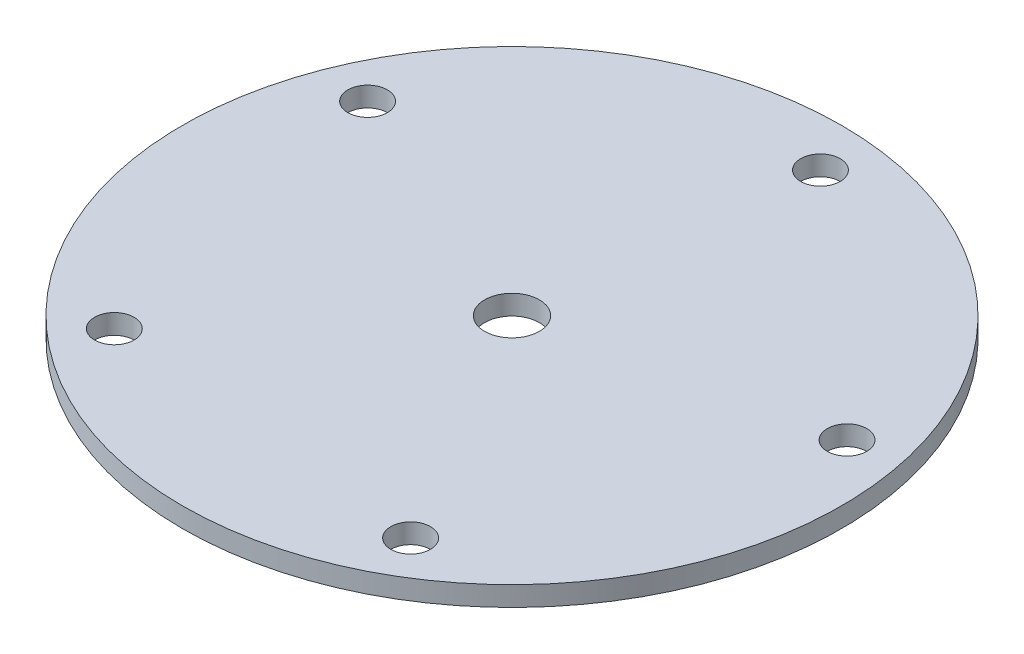
ISO-10303-21;
HEADER;
FILE_DESCRIPTION(('STEP AP214'),'2;1');
FILE_NAME('part.step','',(''),(''),'','','');
FILE_SCHEMA(('AUTOMOTIVE_DESIGN { 1 0 10303 214 1 1 1 1 }'));
ENDSEC;
DATA;
#1=APPLICATION_CONTEXT('core data for automotive mechanical design processes');
#2=APPLICATION_PROTOCOL_DEFINITION('international standard','automotive_design',2000,#1);
#3=PRODUCT_CONTEXT('',#1,'mechanical');
#4=PRODUCT('Part','Part','',(#3));
#5=PRODUCT_RELATED_PRODUCT_CATEGORY('part','',(#4));
#6=PRODUCT_DEFINITION_FORMATION('','',#4);
#7=PRODUCT_DEFINITION_CONTEXT('part definition',#1,'design');
#8=PRODUCT_DEFINITION('design','',#6,#7);
#9=PRODUCT_DEFINITION_SHAPE('','',#8);
#10=(LENGTH_UNIT() NAMED_UNIT(*) SI_UNIT(.MILLI.,.METRE.));
#11=(NAMED_UNIT(*) PLANE_ANGLE_UNIT() SI_UNIT($,.RADIAN.));
#12=(NAMED_UNIT(*) SI_UNIT($,.STERADIAN.) SOLID_ANGLE_UNIT());
#13=UNCERTAINTY_MEASURE_WITH_UNIT(LENGTH_MEASURE(1.E-05),#10,'distance_accuracy_value','');
#14=(GEOMETRIC_REPRESENTATION_CONTEXT(3) GLOBAL_UNCERTAINTY_ASSIGNED_CONTEXT((#13)) GLOBAL_UNIT_ASSIGNED_CONTEXT((#10,
#11,#12)) REPRESENTATION_CONTEXT('',''));
#15=CARTESIAN_POINT('',(0.,0.,0.));
#16=DIRECTION('',(0.,0.,1.));
#17=DIRECTION('',(1.,0.,0.));
#18=AXIS2_PLACEMENT_3D('',#15,#16,#17);
#19=CARTESIAN_POINT('',(0.,3.,0.));
#20=DIRECTION('',(0.,-1.,0.));
#21=DIRECTION('',(0.,0.,-1.));
#22=AXIS2_PLACEMENT_3D('',#19,#20,#21);
#23=CYLINDRICAL_SURFACE('',#22,50.);
#24=CARTESIAN_POINT('',(0.,3.,0.));
#25=DIRECTION('',(0.,1.,0.));
#26=DIRECTION('',(0.,0.,1.));
#27=AXIS2_PLACEMENT_3D('',#24,#25,#26);
#28=CIRCLE('',#27,50.);
#29=CARTESIAN_POINT('',(0.,3.,50.));
#30=VERTEX_POINT('',#29);
#31=EDGE_CURVE('E10',#30,#30,#28,.T.);
#32=ORIENTED_EDGE('',*,*,#31,.F.);
#33=EDGE_LOOP('',(#32));
#34=FACE_BOUND('',#33,.T.);
#35=CARTESIAN_POINT('',(0.,0.,0.));
#36=DIRECTION('',(0.,1.,0.));
#37=DIRECTION('',(0.,0.,1.));
#38=AXIS2_PLACEMENT_3D('',#35,#36,#37);
#39=CIRCLE('',#38,50.);
#40=CARTESIAN_POINT('',(0.,0.,50.));
#41=VERTEX_POINT('',#40);
#42=EDGE_CURVE('E45',#41,#41,#39,.T.);
#43=ORIENTED_EDGE('',*,*,#42,.T.);
#44=EDGE_LOOP('',(#43));
#45=FACE_BOUND('',#44,.T.);
#46=ADVANCED_FACE('F37',(#34,#45),#23,.T.);
#47=CARTESIAN_POINT('',(0.,3.,0.));
#48=DIRECTION('',(0.,1.,0.));
#49=DIRECTION('',(0.,0.,1.));
#50=AXIS2_PLACEMENT_3D('',#47,#48,#49);
#51=PLANE('',#50);
#52=CARTESIAN_POINT('',(21.5307676084281,3.,36.91156861408));
#53=DIRECTION('',(0.,1.,0.));
#54=DIRECTION('',(0.,0.,1.));
#55=AXIS2_PLACEMENT_3D('',#52,#53,#54);
#56=CIRCLE('',#55,3.);
#57=CARTESIAN_POINT('',(21.5307676084281,3.,39.91156861408));
#58=VERTEX_POINT('',#57);
#59=EDGE_CURVE('E152',#58,#58,#56,.T.);
#60=ORIENTED_EDGE('',*,*,#59,.F.);
#61=EDGE_LOOP('',(#60));
#62=FACE_BOUND('',#61,.T.);
#63=CARTESIAN_POINT('',(41.7583609500383,3.,-9.07067484404461));
#64=DIRECTION('',(0.,1.,0.));
#65=DIRECTION('',(0.,0.,1.));
#66=AXIS2_PLACEMENT_3D('',#63,#64,#65);
#67=CIRCLE('',#66,3.);
#68=CARTESIAN_POINT('',(41.7583609500383,3.,-6.07067484404461));
#69=VERTEX_POINT('',#68);
#70=EDGE_CURVE('E146',#69,#69,#67,.T.);
#71=ORIENTED_EDGE('',*,*,#70,.F.);
#72=EDGE_LOOP('',(#71));
#73=FACE_BOUND('',#72,.T.);
#74=CARTESIAN_POINT('',(4.27731877318173,3.,-42.5175539685982));
#75=DIRECTION('',(0.,1.,0.));
#76=DIRECTION('',(0.,0.,1.));
#77=AXIS2_PLACEMENT_3D('',#74,#75,#76);
#78=CIRCLE('',#77,3.);
#79=CARTESIAN_POINT('',(4.27731877318173,3.,-39.5175539685982));
#80=VERTEX_POINT('',#79);
#81=EDGE_CURVE('E140',#80,#80,#78,.T.);
#82=ORIENTED_EDGE('',*,*,#81,.F.);
#83=EDGE_LOOP('',(#82));
#84=FACE_BOUND('',#83,.T.);
#85=CARTESIAN_POINT('',(-39.1148325674941,3.,-17.2066186270568));
#86=DIRECTION('',(0.,1.,0.));
#87=DIRECTION('',(0.,0.,1.));
#88=AXIS2_PLACEMENT_3D('',#85,#86,#87);
#89=CIRCLE('',#88,3.);
#90=CARTESIAN_POINT('',(-39.1148325674941,3.,-14.2066186270568));
#91=VERTEX_POINT('',#90);
#92=EDGE_CURVE('E127',#91,#91,#89,.T.);
#93=ORIENTED_EDGE('',*,*,#92,.F.);
#94=EDGE_LOOP('',(#93));
#95=FACE_BOUND('',#94,.T.);
#96=CARTESIAN_POINT('',(-28.4516147641542,3.,31.8832788256201));
#97=DIRECTION('',(0.,1.,0.));
#98=DIRECTION('',(0.,0.,1.));
#99=AXIS2_PLACEMENT_3D('',#96,#97,#98);
#100=CIRCLE('',#99,3.);
#101=CARTESIAN_POINT('',(-28.4516147641542,3.,34.8832788256201));
#102=VERTEX_POINT('',#101);
#103=EDGE_CURVE('E65',#102,#102,#100,.T.);
#104=ORIENTED_EDGE('',*,*,#103,.F.);
#105=EDGE_LOOP('',(#104));
#106=FACE_BOUND('',#105,.T.);
#107=CARTESIAN_POINT('',(0.,3.,0.));
#108=DIRECTION('',(0.,1.,0.));
#109=DIRECTION('',(0.,0.,1.));
#110=AXIS2_PLACEMENT_3D('',#107,#108,#109);
#111=CIRCLE('',#110,4.15);
#112=CARTESIAN_POINT('',(0.,3.,4.15));
#113=VERTEX_POINT('',#112);
#114=EDGE_CURVE('E54',#113,#113,#111,.T.);
#115=ORIENTED_EDGE('',*,*,#114,.F.);
#116=EDGE_LOOP('',(#115));
#117=FACE_BOUND('',#116,.T.);
#118=ORIENTED_EDGE('',*,*,#31,.T.);
#119=EDGE_LOOP('',(#118));
#120=FACE_BOUND('',#119,.T.);
#121=ADVANCED_FACE('F88',(#62,#73,#84,#95,#106,#117,#120),#51,.T.);
#122=CARTESIAN_POINT('',(0.,0.,0.));
#123=DIRECTION('',(0.,1.,0.));
#124=DIRECTION('',(0.,0.,1.));
#125=AXIS2_PLACEMENT_3D('',#122,#123,#124);
#126=PLANE('',#125);
#127=CARTESIAN_POINT('',(21.5307676084281,0.,36.91156861408));
#128=DIRECTION('',(0.,1.,0.));
#129=DIRECTION('',(0.,0.,1.));
#130=AXIS2_PLACEMENT_3D('',#127,#128,#129);
#131=CIRCLE('',#130,3.);
#132=CARTESIAN_POINT('',(21.5307676084281,0.,39.91156861408));
#133=VERTEX_POINT('',#132);
#134=EDGE_CURVE('E40',#133,#133,#131,.T.);
#135=ORIENTED_EDGE('',*,*,#134,.T.);
#136=EDGE_LOOP('',(#135));
#137=FACE_BOUND('',#136,.T.);
#138=CARTESIAN_POINT('',(41.7583609500383,0.,-9.07067484404461));
#139=DIRECTION('',(0.,1.,0.));
#140=DIRECTION('',(0.,0.,1.));
#141=AXIS2_PLACEMENT_3D('',#138,#139,#140);
#142=CIRCLE('',#141,3.);
#143=CARTESIAN_POINT('',(41.7583609500383,0.,-6.07067484404461));
#144=VERTEX_POINT('',#143);
#145=EDGE_CURVE('E72',#144,#144,#142,.T.);
#146=ORIENTED_EDGE('',*,*,#145,.T.);
#147=EDGE_LOOP('',(#146));
#148=FACE_BOUND('',#147,.T.);
#149=CARTESIAN_POINT('',(4.27731877318173,0.,-42.5175539685982));
#150=DIRECTION('',(0.,1.,0.));
#151=DIRECTION('',(0.,0.,1.));
#152=AXIS2_PLACEMENT_3D('',#149,#150,#151);
#153=CIRCLE('',#152,3.);
#154=CARTESIAN_POINT('',(4.27731877318173,0.,-39.5175539685982));
#155=VERTEX_POINT('',#154);
#156=EDGE_CURVE('E69',#155,#155,#153,.T.);
#157=ORIENTED_EDGE('',*,*,#156,.T.);
#158=EDGE_LOOP('',(#157));
#159=FACE_BOUND('',#158,.T.);
#160=CARTESIAN_POINT('',(-39.1148325674941,0.,-17.2066186270568));
#161=DIRECTION('',(0.,1.,0.));
#162=DIRECTION('',(0.,0.,1.));
#163=AXIS2_PLACEMENT_3D('',#160,#161,#162);
#164=CIRCLE('',#163,3.);
#165=CARTESIAN_POINT('',(-39.1148325674941,0.,-14.2066186270568));
#166=VERTEX_POINT('',#165);
#167=EDGE_CURVE('E64',#166,#166,#164,.T.);
#168=ORIENTED_EDGE('',*,*,#167,.T.);
#169=EDGE_LOOP('',(#168));
#170=FACE_BOUND('',#169,.T.);
#171=CARTESIAN_POINT('',(-28.4516147641542,0.,31.8832788256201));
#172=DIRECTION('',(0.,1.,0.));
#173=DIRECTION('',(0.,0.,1.));
#174=AXIS2_PLACEMENT_3D('',#171,#172,#173);
#175=CIRCLE('',#174,3.);
#176=CARTESIAN_POINT('',(-28.4516147641542,0.,34.8832788256201));
#177=VERTEX_POINT('',#176);
#178=EDGE_CURVE('E60',#177,#177,#175,.T.);
#179=ORIENTED_EDGE('',*,*,#178,.T.);
#180=EDGE_LOOP('',(#179));
#181=FACE_BOUND('',#180,.T.);
#182=CARTESIAN_POINT('',(0.,0.,0.));
#183=DIRECTION('',(0.,1.,0.));
#184=DIRECTION('',(0.,0.,1.));
#185=AXIS2_PLACEMENT_3D('',#182,#183,#184);
#186=CIRCLE('',#185,4.15);
#187=CARTESIAN_POINT('',(0.,0.,4.15));
#188=VERTEX_POINT('',#187);
#189=EDGE_CURVE('E51',#188,#188,#186,.T.);
#190=ORIENTED_EDGE('',*,*,#189,.T.);
#191=EDGE_LOOP('',(#190));
#192=FACE_BOUND('',#191,.T.);
#193=ORIENTED_EDGE('',*,*,#42,.F.);
#194=EDGE_LOOP('',(#193));
#195=FACE_BOUND('',#194,.T.);
#196=ADVANCED_FACE('F90',(#137,#148,#159,#170,#181,#192,#195),#126,.F.);
#197=CARTESIAN_POINT('',(0.,-2.,0.));
#198=DIRECTION('',(0.,1.,0.));
#199=DIRECTION('',(0.,0.,1.));
#200=AXIS2_PLACEMENT_3D('',#197,#198,#199);
#201=CYLINDRICAL_SURFACE('',#200,4.15);
#202=ORIENTED_EDGE('',*,*,#114,.T.);
#203=EDGE_LOOP('',(#202));
#204=FACE_BOUND('',#203,.T.);
#205=ORIENTED_EDGE('',*,*,#189,.F.);
#206=EDGE_LOOP('',(#205));
#207=FACE_BOUND('',#206,.T.);
#208=ADVANCED_FACE('F85',(#204,#207),#201,.F.);
#209=CARTESIAN_POINT('',(-28.4516147641542,-7.,31.8832788256201));
#210=DIRECTION('',(0.,1.,0.));
#211=DIRECTION('',(0.,0.,1.));
#212=AXIS2_PLACEMENT_3D('',#209,#210,#211);
#213=CYLINDRICAL_SURFACE('',#212,3.);
#214=ORIENTED_EDGE('',*,*,#103,.T.);
#215=EDGE_LOOP('',(#214));
#216=FACE_BOUND('',#215,.T.);
#217=ORIENTED_EDGE('',*,*,#178,.F.);
#218=EDGE_LOOP('',(#217));
#219=FACE_BOUND('',#218,.T.);
#220=ADVANCED_FACE('F103',(#216,#219),#213,.F.);
#221=CARTESIAN_POINT('',(-39.1148325674941,-7.,-17.2066186270568));
#222=DIRECTION('',(0.,1.,0.));
#223=DIRECTION('',(0.,0.,1.));
#224=AXIS2_PLACEMENT_3D('',#221,#222,#223);
#225=CYLINDRICAL_SURFACE('',#224,3.);
#226=ORIENTED_EDGE('',*,*,#92,.T.);
#227=EDGE_LOOP('',(#226));
#228=FACE_BOUND('',#227,.T.);
#229=ORIENTED_EDGE('',*,*,#167,.F.);
#230=EDGE_LOOP('',(#229));
#231=FACE_BOUND('',#230,.T.);
#232=ADVANCED_FACE('F106',(#228,#231),#225,.F.);
#233=CARTESIAN_POINT('',(4.27731877318173,-7.,-42.5175539685982));
#234=DIRECTION('',(0.,1.,0.));
#235=DIRECTION('',(0.,0.,1.));
#236=AXIS2_PLACEMENT_3D('',#233,#234,#235);
#237=CYLINDRICAL_SURFACE('',#236,3.);
#238=ORIENTED_EDGE('',*,*,#81,.T.);
#239=EDGE_LOOP('',(#238));
#240=FACE_BOUND('',#239,.T.);
#241=ORIENTED_EDGE('',*,*,#156,.F.);
#242=EDGE_LOOP('',(#241));
#243=FACE_BOUND('',#242,.T.);
#244=ADVANCED_FACE('F115',(#240,#243),#237,.F.);
#245=CARTESIAN_POINT('',(41.7583609500383,-7.,-9.07067484404461));
#246=DIRECTION('',(0.,1.,0.));
#247=DIRECTION('',(0.,0.,1.));
#248=AXIS2_PLACEMENT_3D('',#245,#246,#247);
#249=CYLINDRICAL_SURFACE('',#248,3.);
#250=ORIENTED_EDGE('',*,*,#70,.T.);
#251=EDGE_LOOP('',(#250));
#252=FACE_BOUND('',#251,.T.);
#253=ORIENTED_EDGE('',*,*,#145,.F.);
#254=EDGE_LOOP('',(#253));
#255=FACE_BOUND('',#254,.T.);
#256=ADVANCED_FACE('F111',(#252,#255),#249,.F.);
#257=CARTESIAN_POINT('',(21.5307676084281,-7.,36.91156861408));
#258=DIRECTION('',(0.,1.,0.));
#259=DIRECTION('',(0.,0.,1.));
#260=AXIS2_PLACEMENT_3D('',#257,#258,#259);
#261=CYLINDRICAL_SURFACE('',#260,3.);
#262=ORIENTED_EDGE('',*,*,#59,.T.);
#263=EDGE_LOOP('',(#262));
#264=FACE_BOUND('',#263,.T.);
#265=ORIENTED_EDGE('',*,*,#134,.F.);
#266=EDGE_LOOP('',(#265));
#267=FACE_BOUND('',#266,.T.);
#268=ADVANCED_FACE('F108',(#264,#267),#261,.F.);
#269=CLOSED_SHELL('',(#46,#121,#196,#208,#220,#232,#244,#256,#268));
#270=MANIFOLD_SOLID_BREP('B2',#269);
#271=ADVANCED_BREP_SHAPE_REPRESENTATION('',(#18,#270),#14);
#272=SHAPE_DEFINITION_REPRESENTATION(#9,#271);
ENDSEC;
END-ISO-10303-21;
